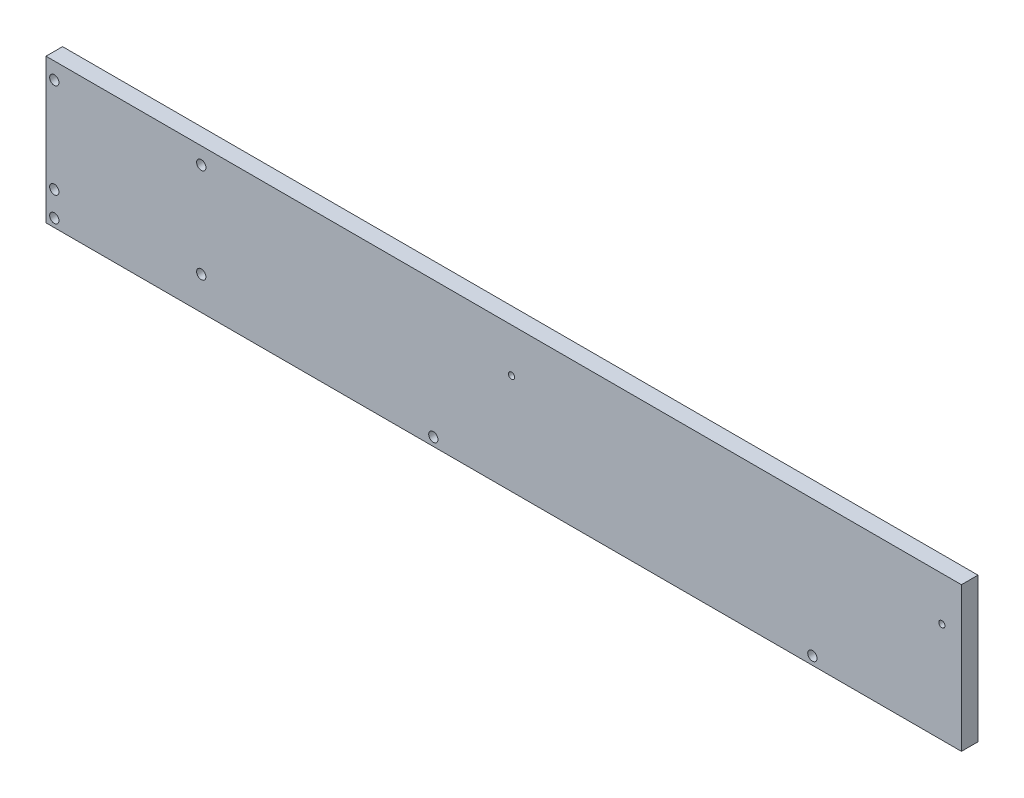
ISO-10303-21;
HEADER;
FILE_DESCRIPTION(('STEP AP214'),'2;1');
FILE_NAME('part.step','',(''),(''),'','','');
FILE_SCHEMA(('AUTOMOTIVE_DESIGN { 1 0 10303 214 1 1 1 1 }'));
ENDSEC;
DATA;
#1=APPLICATION_CONTEXT('core data for automotive mechanical design processes');
#2=APPLICATION_PROTOCOL_DEFINITION('international standard','automotive_design',2000,#1);
#3=PRODUCT_CONTEXT('',#1,'mechanical');
#4=PRODUCT('Part','Part','',(#3));
#5=PRODUCT_RELATED_PRODUCT_CATEGORY('part','',(#4));
#6=PRODUCT_DEFINITION_FORMATION('','',#4);
#7=PRODUCT_DEFINITION_CONTEXT('part definition',#1,'design');
#8=PRODUCT_DEFINITION('design','',#6,#7);
#9=PRODUCT_DEFINITION_SHAPE('','',#8);
#10=(LENGTH_UNIT() NAMED_UNIT(*) SI_UNIT(.MILLI.,.METRE.));
#11=(NAMED_UNIT(*) PLANE_ANGLE_UNIT() SI_UNIT($,.RADIAN.));
#12=(NAMED_UNIT(*) SI_UNIT($,.STERADIAN.) SOLID_ANGLE_UNIT());
#13=UNCERTAINTY_MEASURE_WITH_UNIT(LENGTH_MEASURE(1.E-05),#10,'distance_accuracy_value','');
#14=(GEOMETRIC_REPRESENTATION_CONTEXT(3) GLOBAL_UNCERTAINTY_ASSIGNED_CONTEXT((#13)) GLOBAL_UNIT_ASSIGNED_CONTEXT((#10,
#11,#12)) REPRESENTATION_CONTEXT('',''));
#15=CARTESIAN_POINT('',(0.,0.,0.));
#16=DIRECTION('',(0.,0.,1.));
#17=DIRECTION('',(1.,0.,0.));
#18=AXIS2_PLACEMENT_3D('',#15,#16,#17);
#19=CARTESIAN_POINT('',(0.,0.,6.35));
#20=DIRECTION('',(0.,0.,1.));
#21=DIRECTION('',(1.,0.,0.));
#22=AXIS2_PLACEMENT_3D('',#19,#20,#21);
#23=PLANE('',#22);
#24=CARTESIAN_POINT('',(59.525,12.7,6.35));
#25=DIRECTION('',(0.,0.,1.));
#26=DIRECTION('',(1.,0.,0.));
#27=AXIS2_PLACEMENT_3D('',#24,#25,#26);
#28=CIRCLE('',#27,1.78593749999999);
#29=CARTESIAN_POINT('',(61.3109375,12.7,6.35));
#30=VERTEX_POINT('',#29);
#31=EDGE_CURVE('E182',#30,#30,#28,.T.);
#32=ORIENTED_EDGE('',*,*,#31,.F.);
#33=EDGE_LOOP('',(#32));
#34=FACE_BOUND('',#33,.T.);
#35=CARTESIAN_POINT('',(343.49,38.5,6.35));
#36=DIRECTION('',(0.,0.,1.));
#37=DIRECTION('',(1.,0.,0.));
#38=AXIS2_PLACEMENT_3D('',#35,#36,#37);
#39=CIRCLE('',#38,1.19062499999998);
#40=CARTESIAN_POINT('',(344.680625,38.5,6.35));
#41=VERTEX_POINT('',#40);
#42=EDGE_CURVE('E166',#41,#41,#39,.T.);
#43=ORIENTED_EDGE('',*,*,#42,.F.);
#44=EDGE_LOOP('',(#43));
#45=FACE_BOUND('',#44,.T.);
#46=CARTESIAN_POINT('',(3.17500000000001,3.175,6.35));
#47=DIRECTION('',(0.,0.,1.));
#48=DIRECTION('',(1.,0.,0.));
#49=AXIS2_PLACEMENT_3D('',#46,#47,#48);
#50=CIRCLE('',#49,1.78593749999999);
#51=CARTESIAN_POINT('',(4.9609375,3.175,6.35));
#52=VERTEX_POINT('',#51);
#53=EDGE_CURVE('E150',#52,#52,#50,.T.);
#54=ORIENTED_EDGE('',*,*,#53,.F.);
#55=EDGE_LOOP('',(#54));
#56=FACE_BOUND('',#55,.T.);
#57=CARTESIAN_POINT('',(3.17499999999998,12.7,6.35));
#58=DIRECTION('',(0.,0.,1.));
#59=DIRECTION('',(1.,0.,0.));
#60=AXIS2_PLACEMENT_3D('',#57,#58,#59);
#61=CIRCLE('',#60,1.78593750000002);
#62=CARTESIAN_POINT('',(4.9609375,12.7,6.35));
#63=VERTEX_POINT('',#62);
#64=EDGE_CURVE('E134',#63,#63,#61,.T.);
#65=ORIENTED_EDGE('',*,*,#64,.F.);
#66=EDGE_LOOP('',(#65));
#67=FACE_BOUND('',#66,.T.);
#68=DIRECTION('',(0.,-1.,0.));
#69=VECTOR('',#68,1.);
#70=CARTESIAN_POINT('',(0.,55.35,6.35));
#71=LINE('',#70,#69);
#72=CARTESIAN_POINT('',(0.,55.35,6.35));
#73=VERTEX_POINT('',#72);
#74=CARTESIAN_POINT('',(0.,0.,6.35));
#75=VERTEX_POINT('',#74);
#76=EDGE_CURVE('E92',#73,#75,#71,.T.);
#77=ORIENTED_EDGE('',*,*,#76,.T.);
#78=DIRECTION('',(1.,0.,0.));
#79=VECTOR('',#78,1.);
#80=CARTESIAN_POINT('',(0.,0.,6.35));
#81=LINE('',#80,#79);
#82=CARTESIAN_POINT('',(350.99,0.,6.35));
#83=VERTEX_POINT('',#82);
#84=EDGE_CURVE('E87',#75,#83,#81,.T.);
#85=ORIENTED_EDGE('',*,*,#84,.T.);
#86=DIRECTION('',(0.,1.,0.));
#87=VECTOR('',#86,1.);
#88=CARTESIAN_POINT('',(350.99,0.,6.35));
#89=LINE('',#88,#87);
#90=CARTESIAN_POINT('',(350.99,55.35,6.35));
#91=VERTEX_POINT('',#90);
#92=EDGE_CURVE('E90',#83,#91,#89,.T.);
#93=ORIENTED_EDGE('',*,*,#92,.T.);
#94=DIRECTION('',(-1.,0.,0.));
#95=VECTOR('',#94,1.);
#96=CARTESIAN_POINT('',(350.99,55.35,6.35));
#97=LINE('',#96,#95);
#98=EDGE_CURVE('E57',#91,#73,#97,.T.);
#99=ORIENTED_EDGE('',*,*,#98,.T.);
#100=EDGE_LOOP('',(#77,#85,#93,#99));
#101=FACE_BOUND('',#100,.T.);
#102=CARTESIAN_POINT('',(148.5075,3.17500000000001,6.35));
#103=DIRECTION('',(0.,0.,1.));
#104=DIRECTION('',(1.,0.,0.));
#105=AXIS2_PLACEMENT_3D('',#102,#103,#104);
#106=CIRCLE('',#105,1.78593750000002);
#107=CARTESIAN_POINT('',(150.2934375,3.17500000000001,6.35));
#108=VERTEX_POINT('',#107);
#109=EDGE_CURVE('E112',#108,#108,#106,.T.);
#110=ORIENTED_EDGE('',*,*,#109,.F.);
#111=EDGE_LOOP('',(#110));
#112=FACE_BOUND('',#111,.T.);
#113=CARTESIAN_POINT('',(3.17500000000001,49.,6.35));
#114=DIRECTION('',(0.,0.,1.));
#115=DIRECTION('',(1.,0.,0.));
#116=AXIS2_PLACEMENT_3D('',#113,#114,#115);
#117=CIRCLE('',#116,1.78593749999999);
#118=CARTESIAN_POINT('',(4.9609375,49.,6.35));
#119=VERTEX_POINT('',#118);
#120=EDGE_CURVE('E142',#119,#119,#117,.T.);
#121=ORIENTED_EDGE('',*,*,#120,.F.);
#122=EDGE_LOOP('',(#121));
#123=FACE_BOUND('',#122,.T.);
#124=CARTESIAN_POINT('',(178.49,38.5,6.35));
#125=DIRECTION('',(0.,0.,1.));
#126=DIRECTION('',(1.,0.,0.));
#127=AXIS2_PLACEMENT_3D('',#124,#125,#126);
#128=CIRCLE('',#127,1.190625);
#129=CARTESIAN_POINT('',(179.680625,38.5,6.35));
#130=VERTEX_POINT('',#129);
#131=EDGE_CURVE('E158',#130,#130,#128,.T.);
#132=ORIENTED_EDGE('',*,*,#131,.F.);
#133=EDGE_LOOP('',(#132));
#134=FACE_BOUND('',#133,.T.);
#135=CARTESIAN_POINT('',(293.84,3.175,6.35));
#136=DIRECTION('',(0.,0.,1.));
#137=DIRECTION('',(1.,0.,0.));
#138=AXIS2_PLACEMENT_3D('',#135,#136,#137);
#139=CIRCLE('',#138,1.78593749999999);
#140=CARTESIAN_POINT('',(295.6259375,3.175,6.35));
#141=VERTEX_POINT('',#140);
#142=EDGE_CURVE('E174',#141,#141,#139,.T.);
#143=ORIENTED_EDGE('',*,*,#142,.F.);
#144=EDGE_LOOP('',(#143));
#145=FACE_BOUND('',#144,.T.);
#146=CARTESIAN_POINT('',(59.525,49.,6.35));
#147=DIRECTION('',(0.,0.,1.));
#148=DIRECTION('',(1.,0.,0.));
#149=AXIS2_PLACEMENT_3D('',#146,#147,#148);
#150=CIRCLE('',#149,1.7859375);
#151=CARTESIAN_POINT('',(61.3109375,49.,6.35));
#152=VERTEX_POINT('',#151);
#153=EDGE_CURVE('E190',#152,#152,#150,.T.);
#154=ORIENTED_EDGE('',*,*,#153,.F.);
#155=EDGE_LOOP('',(#154));
#156=FACE_BOUND('',#155,.T.);
#157=ADVANCED_FACE('F39',(#34,#45,#56,#67,#101,#112,#123,#134,#145,#156),#23,.T.);
#158=CARTESIAN_POINT('',(0.,0.,0.));
#159=DIRECTION('',(0.,0.,1.));
#160=DIRECTION('',(1.,0.,0.));
#161=AXIS2_PLACEMENT_3D('',#158,#159,#160);
#162=PLANE('',#161);
#163=DIRECTION('',(0.,-1.,0.));
#164=VECTOR('',#163,1.);
#165=CARTESIAN_POINT('',(0.,55.35,0.));
#166=LINE('',#165,#164);
#167=CARTESIAN_POINT('',(0.,55.35,0.));
#168=VERTEX_POINT('',#167);
#169=CARTESIAN_POINT('',(0.,0.,0.));
#170=VERTEX_POINT('',#169);
#171=EDGE_CURVE('E108',#168,#170,#166,.T.);
#172=ORIENTED_EDGE('',*,*,#171,.F.);
#173=DIRECTION('',(-1.,0.,0.));
#174=VECTOR('',#173,1.);
#175=CARTESIAN_POINT('',(350.99,55.35,0.));
#176=LINE('',#175,#174);
#177=CARTESIAN_POINT('',(350.99,55.35,0.));
#178=VERTEX_POINT('',#177);
#179=EDGE_CURVE('E80',#178,#168,#176,.T.);
#180=ORIENTED_EDGE('',*,*,#179,.F.);
#181=DIRECTION('',(0.,1.,0.));
#182=VECTOR('',#181,1.);
#183=CARTESIAN_POINT('',(350.99,0.,0.));
#184=LINE('',#183,#182);
#185=CARTESIAN_POINT('',(350.99,0.,0.));
#186=VERTEX_POINT('',#185);
#187=EDGE_CURVE('E74',#186,#178,#184,.T.);
#188=ORIENTED_EDGE('',*,*,#187,.F.);
#189=DIRECTION('',(1.,0.,0.));
#190=VECTOR('',#189,1.);
#191=CARTESIAN_POINT('',(0.,0.,0.));
#192=LINE('',#191,#190);
#193=EDGE_CURVE('E97',#170,#186,#192,.T.);
#194=ORIENTED_EDGE('',*,*,#193,.F.);
#195=EDGE_LOOP('',(#172,#180,#188,#194));
#196=FACE_BOUND('',#195,.T.);
#197=CARTESIAN_POINT('',(148.5075,3.17500000000001,0.));
#198=DIRECTION('',(0.,0.,1.));
#199=DIRECTION('',(1.,0.,0.));
#200=AXIS2_PLACEMENT_3D('',#197,#198,#199);
#201=CIRCLE('',#200,1.78593750000002);
#202=CARTESIAN_POINT('',(150.2934375,3.17500000000001,0.));
#203=VERTEX_POINT('',#202);
#204=EDGE_CURVE('E130',#203,#203,#201,.T.);
#205=ORIENTED_EDGE('',*,*,#204,.T.);
#206=EDGE_LOOP('',(#205));
#207=FACE_BOUND('',#206,.T.);
#208=CARTESIAN_POINT('',(3.17499999999998,12.7,0.));
#209=DIRECTION('',(0.,0.,1.));
#210=DIRECTION('',(1.,0.,0.));
#211=AXIS2_PLACEMENT_3D('',#208,#209,#210);
#212=CIRCLE('',#211,1.78593750000002);
#213=CARTESIAN_POINT('',(4.9609375,12.7,0.));
#214=VERTEX_POINT('',#213);
#215=EDGE_CURVE('E138',#214,#214,#212,.T.);
#216=ORIENTED_EDGE('',*,*,#215,.T.);
#217=EDGE_LOOP('',(#216));
#218=FACE_BOUND('',#217,.T.);
#219=CARTESIAN_POINT('',(3.17500000000001,49.,0.));
#220=DIRECTION('',(0.,0.,1.));
#221=DIRECTION('',(1.,0.,0.));
#222=AXIS2_PLACEMENT_3D('',#219,#220,#221);
#223=CIRCLE('',#222,1.78593749999999);
#224=CARTESIAN_POINT('',(4.9609375,49.,0.));
#225=VERTEX_POINT('',#224);
#226=EDGE_CURVE('E146',#225,#225,#223,.T.);
#227=ORIENTED_EDGE('',*,*,#226,.T.);
#228=EDGE_LOOP('',(#227));
#229=FACE_BOUND('',#228,.T.);
#230=CARTESIAN_POINT('',(3.17500000000001,3.175,0.));
#231=DIRECTION('',(0.,0.,1.));
#232=DIRECTION('',(1.,0.,0.));
#233=AXIS2_PLACEMENT_3D('',#230,#231,#232);
#234=CIRCLE('',#233,1.78593749999999);
#235=CARTESIAN_POINT('',(4.9609375,3.175,0.));
#236=VERTEX_POINT('',#235);
#237=EDGE_CURVE('E154',#236,#236,#234,.T.);
#238=ORIENTED_EDGE('',*,*,#237,.T.);
#239=EDGE_LOOP('',(#238));
#240=FACE_BOUND('',#239,.T.);
#241=CARTESIAN_POINT('',(178.49,38.5,0.));
#242=DIRECTION('',(0.,0.,1.));
#243=DIRECTION('',(1.,0.,0.));
#244=AXIS2_PLACEMENT_3D('',#241,#242,#243);
#245=CIRCLE('',#244,1.190625);
#246=CARTESIAN_POINT('',(179.680625,38.5,0.));
#247=VERTEX_POINT('',#246);
#248=EDGE_CURVE('E162',#247,#247,#245,.T.);
#249=ORIENTED_EDGE('',*,*,#248,.T.);
#250=EDGE_LOOP('',(#249));
#251=FACE_BOUND('',#250,.T.);
#252=CARTESIAN_POINT('',(343.49,38.5,0.));
#253=DIRECTION('',(0.,0.,1.));
#254=DIRECTION('',(1.,0.,0.));
#255=AXIS2_PLACEMENT_3D('',#252,#253,#254);
#256=CIRCLE('',#255,1.19062499999998);
#257=CARTESIAN_POINT('',(344.680625,38.5,0.));
#258=VERTEX_POINT('',#257);
#259=EDGE_CURVE('E170',#258,#258,#256,.T.);
#260=ORIENTED_EDGE('',*,*,#259,.T.);
#261=EDGE_LOOP('',(#260));
#262=FACE_BOUND('',#261,.T.);
#263=CARTESIAN_POINT('',(293.84,3.175,0.));
#264=DIRECTION('',(0.,0.,1.));
#265=DIRECTION('',(1.,0.,0.));
#266=AXIS2_PLACEMENT_3D('',#263,#264,#265);
#267=CIRCLE('',#266,1.78593749999999);
#268=CARTESIAN_POINT('',(295.6259375,3.175,0.));
#269=VERTEX_POINT('',#268);
#270=EDGE_CURVE('E178',#269,#269,#267,.T.);
#271=ORIENTED_EDGE('',*,*,#270,.T.);
#272=EDGE_LOOP('',(#271));
#273=FACE_BOUND('',#272,.T.);
#274=CARTESIAN_POINT('',(59.525,12.7,0.));
#275=DIRECTION('',(0.,0.,1.));
#276=DIRECTION('',(1.,0.,0.));
#277=AXIS2_PLACEMENT_3D('',#274,#275,#276);
#278=CIRCLE('',#277,1.78593749999999);
#279=CARTESIAN_POINT('',(61.3109375,12.7,0.));
#280=VERTEX_POINT('',#279);
#281=EDGE_CURVE('E186',#280,#280,#278,.T.);
#282=ORIENTED_EDGE('',*,*,#281,.T.);
#283=EDGE_LOOP('',(#282));
#284=FACE_BOUND('',#283,.T.);
#285=CARTESIAN_POINT('',(59.525,49.,0.));
#286=DIRECTION('',(0.,0.,1.));
#287=DIRECTION('',(1.,0.,0.));
#288=AXIS2_PLACEMENT_3D('',#285,#286,#287);
#289=CIRCLE('',#288,1.7859375);
#290=CARTESIAN_POINT('',(61.3109375,49.,0.));
#291=VERTEX_POINT('',#290);
#292=EDGE_CURVE('E194',#291,#291,#289,.T.);
#293=ORIENTED_EDGE('',*,*,#292,.T.);
#294=EDGE_LOOP('',(#293));
#295=FACE_BOUND('',#294,.T.);
#296=ADVANCED_FACE('F125',(#196,#207,#218,#229,#240,#251,#262,#273,#284,#295),#162,.F.);
#297=CARTESIAN_POINT('',(0.,55.35,6.35));
#298=DIRECTION('',(1.,0.,0.));
#299=DIRECTION('',(0.,0.,-1.));
#300=AXIS2_PLACEMENT_3D('',#297,#298,#299);
#301=PLANE('',#300);
#302=ORIENTED_EDGE('',*,*,#171,.T.);
#303=DIRECTION('',(0.,0.,-1.));
#304=VECTOR('',#303,1.);
#305=CARTESIAN_POINT('',(0.,0.,6.35));
#306=LINE('',#305,#304);
#307=EDGE_CURVE('E11',#75,#170,#306,.T.);
#308=ORIENTED_EDGE('',*,*,#307,.F.);
#309=ORIENTED_EDGE('',*,*,#76,.F.);
#310=DIRECTION('',(0.,0.,-1.));
#311=VECTOR('',#310,1.);
#312=CARTESIAN_POINT('',(0.,55.35,6.35));
#313=LINE('',#312,#311);
#314=EDGE_CURVE('E104',#73,#168,#313,.T.);
#315=ORIENTED_EDGE('',*,*,#314,.T.);
#316=EDGE_LOOP('',(#302,#308,#309,#315));
#317=FACE_BOUND('',#316,.T.);
#318=ADVANCED_FACE('F41',(#317),#301,.F.);
#319=CARTESIAN_POINT('',(0.,0.,6.35));
#320=DIRECTION('',(0.,1.,0.));
#321=DIRECTION('',(0.,0.,1.));
#322=AXIS2_PLACEMENT_3D('',#319,#320,#321);
#323=PLANE('',#322);
#324=ORIENTED_EDGE('',*,*,#193,.T.);
#325=DIRECTION('',(0.,0.,-1.));
#326=VECTOR('',#325,1.);
#327=CARTESIAN_POINT('',(350.99,0.,6.35));
#328=LINE('',#327,#326);
#329=EDGE_CURVE('E49',#83,#186,#328,.T.);
#330=ORIENTED_EDGE('',*,*,#329,.F.);
#331=ORIENTED_EDGE('',*,*,#84,.F.);
#332=ORIENTED_EDGE('',*,*,#307,.T.);
#333=EDGE_LOOP('',(#324,#330,#331,#332));
#334=FACE_BOUND('',#333,.T.);
#335=ADVANCED_FACE('F96',(#334),#323,.F.);
#336=CARTESIAN_POINT('',(350.99,0.,6.35));
#337=DIRECTION('',(-1.,0.,0.));
#338=DIRECTION('',(0.,0.,1.));
#339=AXIS2_PLACEMENT_3D('',#336,#337,#338);
#340=PLANE('',#339);
#341=ORIENTED_EDGE('',*,*,#187,.T.);
#342=DIRECTION('',(0.,0.,-1.));
#343=VECTOR('',#342,1.);
#344=CARTESIAN_POINT('',(350.99,55.35,6.35));
#345=LINE('',#344,#343);
#346=EDGE_CURVE('E99',#91,#178,#345,.T.);
#347=ORIENTED_EDGE('',*,*,#346,.F.);
#348=ORIENTED_EDGE('',*,*,#92,.F.);
#349=ORIENTED_EDGE('',*,*,#329,.T.);
#350=EDGE_LOOP('',(#341,#347,#348,#349));
#351=FACE_BOUND('',#350,.T.);
#352=ADVANCED_FACE('F100',(#351),#340,.F.);
#353=CARTESIAN_POINT('',(350.99,55.35,6.35));
#354=DIRECTION('',(0.,-1.,0.));
#355=DIRECTION('',(0.,0.,-1.));
#356=AXIS2_PLACEMENT_3D('',#353,#354,#355);
#357=PLANE('',#356);
#358=ORIENTED_EDGE('',*,*,#179,.T.);
#359=ORIENTED_EDGE('',*,*,#314,.F.);
#360=ORIENTED_EDGE('',*,*,#98,.F.);
#361=ORIENTED_EDGE('',*,*,#346,.T.);
#362=EDGE_LOOP('',(#358,#359,#360,#361));
#363=FACE_BOUND('',#362,.T.);
#364=ADVANCED_FACE('F122',(#363),#357,.F.);
#365=CARTESIAN_POINT('',(148.5075,3.17500000000001,6.35));
#366=DIRECTION('',(0.,0.,-1.));
#367=DIRECTION('',(-1.,0.,0.));
#368=AXIS2_PLACEMENT_3D('',#365,#366,#367);
#369=CYLINDRICAL_SURFACE('',#368,1.78593750000002);
#370=ORIENTED_EDGE('',*,*,#109,.T.);
#371=EDGE_LOOP('',(#370));
#372=FACE_BOUND('',#371,.T.);
#373=ORIENTED_EDGE('',*,*,#204,.F.);
#374=EDGE_LOOP('',(#373));
#375=FACE_BOUND('',#374,.T.);
#376=ADVANCED_FACE('F215',(#372,#375),#369,.F.);
#377=CARTESIAN_POINT('',(3.17499999999998,12.7,6.35));
#378=DIRECTION('',(0.,0.,-1.));
#379=DIRECTION('',(-1.,0.,0.));
#380=AXIS2_PLACEMENT_3D('',#377,#378,#379);
#381=CYLINDRICAL_SURFACE('',#380,1.78593750000002);
#382=ORIENTED_EDGE('',*,*,#64,.T.);
#383=EDGE_LOOP('',(#382));
#384=FACE_BOUND('',#383,.T.);
#385=ORIENTED_EDGE('',*,*,#215,.F.);
#386=EDGE_LOOP('',(#385));
#387=FACE_BOUND('',#386,.T.);
#388=ADVANCED_FACE('F261',(#384,#387),#381,.F.);
#389=CARTESIAN_POINT('',(3.17500000000001,49.,6.35));
#390=DIRECTION('',(0.,0.,-1.));
#391=DIRECTION('',(-1.,0.,0.));
#392=AXIS2_PLACEMENT_3D('',#389,#390,#391);
#393=CYLINDRICAL_SURFACE('',#392,1.78593749999999);
#394=ORIENTED_EDGE('',*,*,#120,.T.);
#395=EDGE_LOOP('',(#394));
#396=FACE_BOUND('',#395,.T.);
#397=ORIENTED_EDGE('',*,*,#226,.F.);
#398=EDGE_LOOP('',(#397));
#399=FACE_BOUND('',#398,.T.);
#400=ADVANCED_FACE('F269',(#396,#399),#393,.F.);
#401=CARTESIAN_POINT('',(3.17500000000001,3.175,6.35));
#402=DIRECTION('',(0.,0.,-1.));
#403=DIRECTION('',(-1.,0.,0.));
#404=AXIS2_PLACEMENT_3D('',#401,#402,#403);
#405=CYLINDRICAL_SURFACE('',#404,1.78593749999999);
#406=ORIENTED_EDGE('',*,*,#53,.T.);
#407=EDGE_LOOP('',(#406));
#408=FACE_BOUND('',#407,.T.);
#409=ORIENTED_EDGE('',*,*,#237,.F.);
#410=EDGE_LOOP('',(#409));
#411=FACE_BOUND('',#410,.T.);
#412=ADVANCED_FACE('F277',(#408,#411),#405,.F.);
#413=CARTESIAN_POINT('',(178.49,38.5,6.35));
#414=DIRECTION('',(0.,0.,-1.));
#415=DIRECTION('',(-1.,0.,0.));
#416=AXIS2_PLACEMENT_3D('',#413,#414,#415);
#417=CYLINDRICAL_SURFACE('',#416,1.190625);
#418=ORIENTED_EDGE('',*,*,#131,.T.);
#419=EDGE_LOOP('',(#418));
#420=FACE_BOUND('',#419,.T.);
#421=ORIENTED_EDGE('',*,*,#248,.F.);
#422=EDGE_LOOP('',(#421));
#423=FACE_BOUND('',#422,.T.);
#424=ADVANCED_FACE('F286',(#420,#423),#417,.F.);
#425=CARTESIAN_POINT('',(343.49,38.5,6.35));
#426=DIRECTION('',(0.,0.,-1.));
#427=DIRECTION('',(-1.,0.,0.));
#428=AXIS2_PLACEMENT_3D('',#425,#426,#427);
#429=CYLINDRICAL_SURFACE('',#428,1.19062499999998);
#430=ORIENTED_EDGE('',*,*,#42,.T.);
#431=EDGE_LOOP('',(#430));
#432=FACE_BOUND('',#431,.T.);
#433=ORIENTED_EDGE('',*,*,#259,.F.);
#434=EDGE_LOOP('',(#433));
#435=FACE_BOUND('',#434,.T.);
#436=ADVANCED_FACE('F295',(#432,#435),#429,.F.);
#437=CARTESIAN_POINT('',(293.84,3.175,6.35));
#438=DIRECTION('',(0.,0.,-1.));
#439=DIRECTION('',(-1.,0.,0.));
#440=AXIS2_PLACEMENT_3D('',#437,#438,#439);
#441=CYLINDRICAL_SURFACE('',#440,1.78593749999999);
#442=ORIENTED_EDGE('',*,*,#142,.T.);
#443=EDGE_LOOP('',(#442));
#444=FACE_BOUND('',#443,.T.);
#445=ORIENTED_EDGE('',*,*,#270,.F.);
#446=EDGE_LOOP('',(#445));
#447=FACE_BOUND('',#446,.T.);
#448=ADVANCED_FACE('F304',(#444,#447),#441,.F.);
#449=CARTESIAN_POINT('',(59.525,12.7,6.35));
#450=DIRECTION('',(0.,0.,-1.));
#451=DIRECTION('',(-1.,0.,0.));
#452=AXIS2_PLACEMENT_3D('',#449,#450,#451);
#453=CYLINDRICAL_SURFACE('',#452,1.78593749999999);
#454=ORIENTED_EDGE('',*,*,#31,.T.);
#455=EDGE_LOOP('',(#454));
#456=FACE_BOUND('',#455,.T.);
#457=ORIENTED_EDGE('',*,*,#281,.F.);
#458=EDGE_LOOP('',(#457));
#459=FACE_BOUND('',#458,.T.);
#460=ADVANCED_FACE('F313',(#456,#459),#453,.F.);
#461=CARTESIAN_POINT('',(59.525,49.,6.35));
#462=DIRECTION('',(0.,0.,-1.));
#463=DIRECTION('',(-1.,0.,0.));
#464=AXIS2_PLACEMENT_3D('',#461,#462,#463);
#465=CYLINDRICAL_SURFACE('',#464,1.7859375);
#466=ORIENTED_EDGE('',*,*,#153,.T.);
#467=EDGE_LOOP('',(#466));
#468=FACE_BOUND('',#467,.T.);
#469=ORIENTED_EDGE('',*,*,#292,.F.);
#470=EDGE_LOOP('',(#469));
#471=FACE_BOUND('',#470,.T.);
#472=ADVANCED_FACE('F202',(#468,#471),#465,.F.);
#473=CLOSED_SHELL('',(#157,#296,#318,#335,#352,#364,#376,#388,#400,#412,#424,#436,#448,#460,#472));
#474=MANIFOLD_SOLID_BREP('B2',#473);
#475=ADVANCED_BREP_SHAPE_REPRESENTATION('',(#18,#474),#14);
#476=SHAPE_DEFINITION_REPRESENTATION(#9,#475);
ENDSEC;
END-ISO-10303-21;
